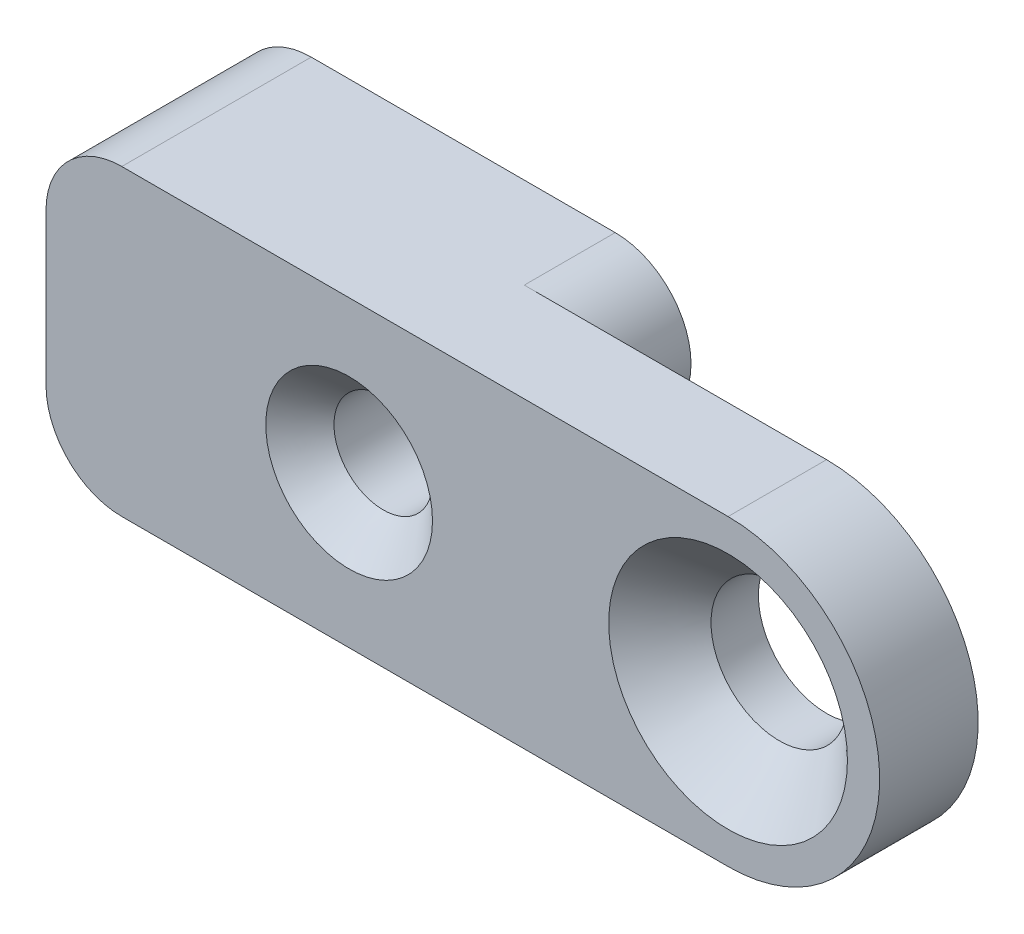
ISO-10303-21;
HEADER;
FILE_DESCRIPTION(('STEP AP214'),'2;1');
FILE_NAME('part.step','',(''),(''),'','','');
FILE_SCHEMA(('AUTOMOTIVE_DESIGN { 1 0 10303 214 1 1 1 1 }'));
ENDSEC;
DATA;
#1=APPLICATION_CONTEXT('core data for automotive mechanical design processes');
#2=APPLICATION_PROTOCOL_DEFINITION('international standard','automotive_design',2000,#1);
#3=PRODUCT_CONTEXT('',#1,'mechanical');
#4=PRODUCT('Part','Part','',(#3));
#5=PRODUCT_RELATED_PRODUCT_CATEGORY('part','',(#4));
#6=PRODUCT_DEFINITION_FORMATION('','',#4);
#7=PRODUCT_DEFINITION_CONTEXT('part definition',#1,'design');
#8=PRODUCT_DEFINITION('design','',#6,#7);
#9=PRODUCT_DEFINITION_SHAPE('','',#8);
#10=(LENGTH_UNIT() NAMED_UNIT(*) SI_UNIT(.MILLI.,.METRE.));
#11=(NAMED_UNIT(*) PLANE_ANGLE_UNIT() SI_UNIT($,.RADIAN.));
#12=(NAMED_UNIT(*) SI_UNIT($,.STERADIAN.) SOLID_ANGLE_UNIT());
#13=UNCERTAINTY_MEASURE_WITH_UNIT(LENGTH_MEASURE(1.E-05),#10,'distance_accuracy_value','');
#14=(GEOMETRIC_REPRESENTATION_CONTEXT(3) GLOBAL_UNCERTAINTY_ASSIGNED_CONTEXT((#13)) GLOBAL_UNIT_ASSIGNED_CONTEXT((#10,
#11,#12)) REPRESENTATION_CONTEXT('',''));
#15=CARTESIAN_POINT('',(0.,0.,0.));
#16=DIRECTION('',(0.,0.,1.));
#17=DIRECTION('',(1.,0.,0.));
#18=AXIS2_PLACEMENT_3D('',#15,#16,#17);
#19=CARTESIAN_POINT('',(10.,0.,2.));
#20=DIRECTION('',(0.,0.,-1.));
#21=DIRECTION('',(-1.,0.,0.));
#22=AXIS2_PLACEMENT_3D('',#19,#20,#21);
#23=CYLINDRICAL_SURFACE('',#22,4.);
#24=CARTESIAN_POINT('',(10.,0.,2.4));
#25=DIRECTION('',(0.,0.,-1.));
#26=DIRECTION('',(-1.,0.,0.));
#27=AXIS2_PLACEMENT_3D('',#24,#25,#26);
#28=CIRCLE('',#27,4.);
#29=CARTESIAN_POINT('',(10.,4.,2.4));
#30=VERTEX_POINT('',#29);
#31=CARTESIAN_POINT('',(10.,-4.,2.4));
#32=VERTEX_POINT('',#31);
#33=EDGE_CURVE('E136',#30,#32,#28,.T.);
#34=ORIENTED_EDGE('',*,*,#33,.F.);
#35=DIRECTION('',(0.,0.,-1.));
#36=VECTOR('',#35,1.);
#37=CARTESIAN_POINT('',(10.,4.,2.));
#38=LINE('',#37,#36);
#39=CARTESIAN_POINT('',(10.,4.,5.));
#40=VERTEX_POINT('',#39);
#41=EDGE_CURVE('E149',#40,#30,#38,.T.);
#42=ORIENTED_EDGE('',*,*,#41,.F.);
#43=CARTESIAN_POINT('',(10.,0.,5.));
#44=DIRECTION('',(0.,0.,1.));
#45=DIRECTION('',(1.,0.,0.));
#46=AXIS2_PLACEMENT_3D('',#43,#44,#45);
#47=CIRCLE('',#46,4.);
#48=CARTESIAN_POINT('',(10.,-4.,5.));
#49=VERTEX_POINT('',#48);
#50=EDGE_CURVE('E183',#49,#40,#47,.T.);
#51=ORIENTED_EDGE('',*,*,#50,.F.);
#52=DIRECTION('',(0.,0.,-1.));
#53=VECTOR('',#52,1.);
#54=CARTESIAN_POINT('',(10.,-4.,2.));
#55=LINE('',#54,#53);
#56=EDGE_CURVE('E152',#49,#32,#55,.T.);
#57=ORIENTED_EDGE('',*,*,#56,.T.);
#58=EDGE_LOOP('',(#34,#42,#51,#57));
#59=FACE_BOUND('',#58,.T.);
#60=ADVANCED_FACE('F32',(#59),#23,.T.);
#61=CARTESIAN_POINT('',(10.,0.,0.));
#62=DIRECTION('',(0.,0.,1.));
#63=DIRECTION('',(1.,0.,0.));
#64=AXIS2_PLACEMENT_3D('',#61,#62,#63);
#65=PLANE('',#64);
#66=DIRECTION('',(-1.,0.,0.));
#67=VECTOR('',#66,1.);
#68=CARTESIAN_POINT('',(10.,4.,0.));
#69=LINE('',#68,#67);
#70=CARTESIAN_POINT('',(2.02186581962926,4.,0.));
#71=VERTEX_POINT('',#70);
#72=CARTESIAN_POINT('',(-5.99999999999998,4.,0.));
#73=VERTEX_POINT('',#72);
#74=EDGE_CURVE('E179',#71,#73,#69,.T.);
#75=ORIENTED_EDGE('',*,*,#74,.F.);
#76=CARTESIAN_POINT('',(2.02186581962926,2.,0.));
#77=DIRECTION('',(0.,0.,1.));
#78=DIRECTION('',(1.,0.,0.));
#79=AXIS2_PLACEMENT_3D('',#76,#77,#78);
#80=CIRCLE('',#79,2.);
#81=CARTESIAN_POINT('',(3.96183765680147,1.51367781155015,0.));
#82=VERTEX_POINT('',#81);
#83=EDGE_CURVE('E216',#71,#82,#80,.F.);
#84=ORIENTED_EDGE('',*,*,#83,.T.);
#85=CARTESIAN_POINT('',(10.,0.,0.));
#86=DIRECTION('',(0.,0.,-1.));
#87=DIRECTION('',(-1.,0.,0.));
#88=AXIS2_PLACEMENT_3D('',#85,#86,#87);
#89=CIRCLE('',#88,6.225);
#90=CARTESIAN_POINT('',(3.96183765680147,-1.51367781155015,0.));
#91=VERTEX_POINT('',#90);
#92=EDGE_CURVE('E246',#91,#82,#89,.T.);
#93=ORIENTED_EDGE('',*,*,#92,.F.);
#94=CARTESIAN_POINT('',(2.02186581962926,-2.,0.));
#95=DIRECTION('',(0.,0.,1.));
#96=DIRECTION('',(1.,0.,0.));
#97=AXIS2_PLACEMENT_3D('',#94,#95,#96);
#98=CIRCLE('',#97,2.);
#99=CARTESIAN_POINT('',(2.02186581962926,-4.,0.));
#100=VERTEX_POINT('',#99);
#101=EDGE_CURVE('E213',#91,#100,#98,.F.);
#102=ORIENTED_EDGE('',*,*,#101,.T.);
#103=DIRECTION('',(1.,0.,0.));
#104=VECTOR('',#103,1.);
#105=CARTESIAN_POINT('',(10.,-4.,0.));
#106=LINE('',#105,#104);
#107=CARTESIAN_POINT('',(-5.99999999999999,-4.,0.));
#108=VERTEX_POINT('',#107);
#109=EDGE_CURVE('E190',#108,#100,#106,.T.);
#110=ORIENTED_EDGE('',*,*,#109,.F.);
#111=CARTESIAN_POINT('',(-5.99999999999999,-2.,0.));
#112=DIRECTION('',(0.,0.,1.));
#113=DIRECTION('',(1.,0.,0.));
#114=AXIS2_PLACEMENT_3D('',#111,#112,#113);
#115=CIRCLE('',#114,2.);
#116=CARTESIAN_POINT('',(-7.74060607489101,-2.9850332441357,0.));
#117=VERTEX_POINT('',#116);
#118=EDGE_CURVE('E209',#108,#117,#115,.F.);
#119=ORIENTED_EDGE('',*,*,#118,.T.);
#120=DIRECTION('',(-0.995037190209989,-0.0995037190209989,0.));
#121=VECTOR('',#120,1.);
#122=CARTESIAN_POINT('',(-7.99999999999999,-3.0109726366466,0.));
#123=LINE('',#122,#121);
#124=CARTESIAN_POINT('',(0.218908181846198,-2.18908181846198,0.));
#125=VERTEX_POINT('',#124);
#126=EDGE_CURVE('E187',#125,#117,#123,.T.);
#127=ORIENTED_EDGE('',*,*,#126,.F.);
#128=CARTESIAN_POINT('',(0.,0.,0.));
#129=DIRECTION('',(0.,0.,-1.));
#130=DIRECTION('',(-1.,0.,0.));
#131=AXIS2_PLACEMENT_3D('',#128,#129,#130);
#132=CIRCLE('',#131,2.2);
#133=CARTESIAN_POINT('',(0.218908181846198,2.18908181846198,0.));
#134=VERTEX_POINT('',#133);
#135=EDGE_CURVE('E185',#134,#125,#132,.T.);
#136=ORIENTED_EDGE('',*,*,#135,.F.);
#137=DIRECTION('',(0.995037190209989,-0.0995037190209989,0.));
#138=VECTOR('',#137,1.);
#139=CARTESIAN_POINT('',(-7.99999999999999,3.0109726366466,0.));
#140=LINE('',#139,#138);
#141=CARTESIAN_POINT('',(-7.740606074891,2.9850332441357,0.));
#142=VERTEX_POINT('',#141);
#143=EDGE_CURVE('E182',#142,#134,#140,.T.);
#144=ORIENTED_EDGE('',*,*,#143,.F.);
#145=CARTESIAN_POINT('',(-5.99999999999999,2.,0.));
#146=DIRECTION('',(0.,0.,1.));
#147=DIRECTION('',(1.,0.,0.));
#148=AXIS2_PLACEMENT_3D('',#145,#146,#147);
#149=CIRCLE('',#148,2.);
#150=EDGE_CURVE('E214',#142,#73,#149,.F.);
#151=ORIENTED_EDGE('',*,*,#150,.T.);
#152=EDGE_LOOP('',(#75,#84,#93,#102,#110,#119,#127,#136,#144,#151));
#153=FACE_BOUND('',#152,.T.);
#154=ADVANCED_FACE('F206',(#153),#65,.F.);
#155=CARTESIAN_POINT('',(10.,4.,2.));
#156=DIRECTION('',(0.,-1.,0.));
#157=DIRECTION('',(1.,0.,0.));
#158=AXIS2_PLACEMENT_3D('',#155,#156,#157);
#159=PLANE('',#158);
#160=DIRECTION('',(1.,0.,0.));
#161=VECTOR('',#160,1.);
#162=CARTESIAN_POINT('',(10.,4.,2.4));
#163=LINE('',#162,#161);
#164=CARTESIAN_POINT('',(2.02186581962926,4.,2.4));
#165=VERTEX_POINT('',#164);
#166=EDGE_CURVE('E133',#165,#30,#163,.T.);
#167=ORIENTED_EDGE('',*,*,#166,.F.);
#168=DIRECTION('',(0.,0.,-1.));
#169=VECTOR('',#168,1.);
#170=CARTESIAN_POINT('',(2.02186581962926,4.,2.));
#171=LINE('',#170,#169);
#172=EDGE_CURVE('E161',#165,#71,#171,.T.);
#173=ORIENTED_EDGE('',*,*,#172,.T.);
#174=ORIENTED_EDGE('',*,*,#74,.T.);
#175=DIRECTION('',(0.,0.,-1.));
#176=VECTOR('',#175,1.);
#177=CARTESIAN_POINT('',(-5.99999999999998,4.,2.));
#178=LINE('',#177,#176);
#179=CARTESIAN_POINT('',(-5.99999999999998,4.,5.));
#180=VERTEX_POINT('',#179);
#181=EDGE_CURVE('E158',#73,#180,#178,.F.);
#182=ORIENTED_EDGE('',*,*,#181,.T.);
#183=DIRECTION('',(-1.,0.,0.));
#184=VECTOR('',#183,1.);
#185=CARTESIAN_POINT('',(10.,4.,5.));
#186=LINE('',#185,#184);
#187=EDGE_CURVE('E157',#40,#180,#186,.T.);
#188=ORIENTED_EDGE('',*,*,#187,.F.);
#189=ORIENTED_EDGE('',*,*,#41,.T.);
#190=EDGE_LOOP('',(#167,#173,#174,#182,#188,#189));
#191=FACE_BOUND('',#190,.T.);
#192=ADVANCED_FACE('F156',(#191),#159,.F.);
#193=CARTESIAN_POINT('',(-7.99999999999999,3.0109726366466,2.));
#194=DIRECTION('',(0.0995037190209989,0.995037190209989,0.));
#195=DIRECTION('',(-0.995037190209989,0.099503719020999,0.));
#196=AXIS2_PLACEMENT_3D('',#193,#194,#195);
#197=PLANE('',#196);
#198=DIRECTION('',(0.995037190209989,-0.0995037190209989,0.));
#199=VECTOR('',#198,1.);
#200=CARTESIAN_POINT('',(-7.99999999999999,3.0109726366466,2.));
#201=LINE('',#200,#199);
#202=CARTESIAN_POINT('',(-7.740606074891,2.9850332441357,2.));
#203=VERTEX_POINT('',#202);
#204=CARTESIAN_POINT('',(0.218908181846198,2.18908181846198,2.));
#205=VERTEX_POINT('',#204);
#206=EDGE_CURVE('E193',#203,#205,#201,.T.);
#207=ORIENTED_EDGE('',*,*,#206,.F.);
#208=DIRECTION('',(0.,0.,-1.));
#209=VECTOR('',#208,1.);
#210=CARTESIAN_POINT('',(-7.740606074891,2.9850332441357,2.));
#211=LINE('',#210,#209);
#212=EDGE_CURVE('E281',#203,#142,#211,.T.);
#213=ORIENTED_EDGE('',*,*,#212,.T.);
#214=ORIENTED_EDGE('',*,*,#143,.T.);
#215=DIRECTION('',(0.,0.,-1.));
#216=VECTOR('',#215,1.);
#217=CARTESIAN_POINT('',(0.218908181846198,2.18908181846198,2.));
#218=LINE('',#217,#216);
#219=EDGE_CURVE('E159',#205,#134,#218,.T.);
#220=ORIENTED_EDGE('',*,*,#219,.F.);
#221=EDGE_LOOP('',(#207,#213,#214,#220));
#222=FACE_BOUND('',#221,.T.);
#223=ADVANCED_FACE('F297',(#222),#197,.F.);
#224=CARTESIAN_POINT('',(0.,0.,2.));
#225=DIRECTION('',(0.,0.,-1.));
#226=DIRECTION('',(-1.,0.,0.));
#227=AXIS2_PLACEMENT_3D('',#224,#225,#226);
#228=CYLINDRICAL_SURFACE('',#227,2.2);
#229=ORIENTED_EDGE('',*,*,#135,.T.);
#230=DIRECTION('',(0.,0.,-1.));
#231=VECTOR('',#230,1.);
#232=CARTESIAN_POINT('',(0.218908181846198,-2.18908181846198,2.));
#233=LINE('',#232,#231);
#234=CARTESIAN_POINT('',(0.218908181846198,-2.18908181846198,2.));
#235=VERTEX_POINT('',#234);
#236=EDGE_CURVE('E164',#235,#125,#233,.T.);
#237=ORIENTED_EDGE('',*,*,#236,.F.);
#238=CARTESIAN_POINT('',(0.,0.,2.));
#239=DIRECTION('',(0.,0.,-1.));
#240=DIRECTION('',(-1.,0.,0.));
#241=AXIS2_PLACEMENT_3D('',#238,#239,#240);
#242=CIRCLE('',#241,2.2);
#243=EDGE_CURVE('E172',#205,#235,#242,.T.);
#244=ORIENTED_EDGE('',*,*,#243,.F.);
#245=ORIENTED_EDGE('',*,*,#219,.T.);
#246=EDGE_LOOP('',(#229,#237,#244,#245));
#247=FACE_BOUND('',#246,.T.);
#248=ADVANCED_FACE('F417',(#247),#228,.F.);
#249=CARTESIAN_POINT('',(-7.99999999999999,-3.0109726366466,2.));
#250=DIRECTION('',(0.0995037190209989,-0.995037190209989,0.));
#251=DIRECTION('',(0.995037190209989,0.099503719020999,0.));
#252=AXIS2_PLACEMENT_3D('',#249,#250,#251);
#253=PLANE('',#252);
#254=ORIENTED_EDGE('',*,*,#126,.T.);
#255=DIRECTION('',(0.,0.,-1.));
#256=VECTOR('',#255,1.);
#257=CARTESIAN_POINT('',(-7.74060607489101,-2.9850332441357,0.));
#258=LINE('',#257,#256);
#259=CARTESIAN_POINT('',(-7.74060607489101,-2.9850332441357,2.));
#260=VERTEX_POINT('',#259);
#261=EDGE_CURVE('E231',#117,#260,#258,.F.);
#262=ORIENTED_EDGE('',*,*,#261,.T.);
#263=DIRECTION('',(-0.995037190209989,-0.0995037190209989,0.));
#264=VECTOR('',#263,1.);
#265=CARTESIAN_POINT('',(-7.99999999999999,-3.0109726366466,2.));
#266=LINE('',#265,#264);
#267=EDGE_CURVE('E168',#235,#260,#266,.T.);
#268=ORIENTED_EDGE('',*,*,#267,.F.);
#269=ORIENTED_EDGE('',*,*,#236,.T.);
#270=EDGE_LOOP('',(#254,#262,#268,#269));
#271=FACE_BOUND('',#270,.T.);
#272=ADVANCED_FACE('F198',(#271),#253,.F.);
#273=CARTESIAN_POINT('',(-8.,-4.,2.));
#274=DIRECTION('',(1.,0.,0.));
#275=DIRECTION('',(0.,1.,0.));
#276=AXIS2_PLACEMENT_3D('',#273,#274,#275);
#277=PLANE('',#276);
#278=DIRECTION('',(0.,-1.,0.));
#279=VECTOR('',#278,1.);
#280=CARTESIAN_POINT('',(-8.,4.,2.));
#281=LINE('',#280,#279);
#282=CARTESIAN_POINT('',(-8.,2.,2.));
#283=VERTEX_POINT('',#282);
#284=CARTESIAN_POINT('',(-8.,-1.99999999999999,2.));
#285=VERTEX_POINT('',#284);
#286=EDGE_CURVE('E144',#283,#285,#281,.T.);
#287=ORIENTED_EDGE('',*,*,#286,.T.);
#288=DIRECTION('',(0.,0.,-1.));
#289=VECTOR('',#288,1.);
#290=CARTESIAN_POINT('',(-7.99999999999999,-1.99999999999999,2.));
#291=LINE('',#290,#289);
#292=CARTESIAN_POINT('',(-8.,-1.99999999999999,5.));
#293=VERTEX_POINT('',#292);
#294=EDGE_CURVE('E47',#285,#293,#291,.F.);
#295=ORIENTED_EDGE('',*,*,#294,.T.);
#296=DIRECTION('',(0.,-1.,0.));
#297=VECTOR('',#296,1.);
#298=CARTESIAN_POINT('',(-8.,4.,5.));
#299=LINE('',#298,#297);
#300=CARTESIAN_POINT('',(-8.,2.,5.));
#301=VERTEX_POINT('',#300);
#302=EDGE_CURVE('E241',#301,#293,#299,.T.);
#303=ORIENTED_EDGE('',*,*,#302,.F.);
#304=DIRECTION('',(0.,0.,-1.));
#305=VECTOR('',#304,1.);
#306=CARTESIAN_POINT('',(-7.99999999999999,2.,2.));
#307=LINE('',#306,#305);
#308=EDGE_CURVE('E287',#301,#283,#307,.T.);
#309=ORIENTED_EDGE('',*,*,#308,.T.);
#310=EDGE_LOOP('',(#287,#295,#303,#309));
#311=FACE_BOUND('',#310,.T.);
#312=ADVANCED_FACE('F396',(#311),#277,.F.);
#313=CARTESIAN_POINT('',(10.,-4.,2.));
#314=DIRECTION('',(0.,1.,0.));
#315=DIRECTION('',(-1.,0.,0.));
#316=AXIS2_PLACEMENT_3D('',#313,#314,#315);
#317=PLANE('',#316);
#318=ORIENTED_EDGE('',*,*,#109,.T.);
#319=DIRECTION('',(0.,0.,-1.));
#320=VECTOR('',#319,1.);
#321=CARTESIAN_POINT('',(2.02186581962926,-4.,2.));
#322=LINE('',#321,#320);
#323=CARTESIAN_POINT('',(2.02186581962926,-4.,2.4));
#324=VERTEX_POINT('',#323);
#325=EDGE_CURVE('E228',#100,#324,#322,.F.);
#326=ORIENTED_EDGE('',*,*,#325,.T.);
#327=DIRECTION('',(-1.,0.,0.));
#328=VECTOR('',#327,1.);
#329=CARTESIAN_POINT('',(10.,-4.,2.4));
#330=LINE('',#329,#328);
#331=EDGE_CURVE('E153',#32,#324,#330,.T.);
#332=ORIENTED_EDGE('',*,*,#331,.F.);
#333=ORIENTED_EDGE('',*,*,#56,.F.);
#334=DIRECTION('',(1.,0.,0.));
#335=VECTOR('',#334,1.);
#336=CARTESIAN_POINT('',(-8.,-4.,5.));
#337=LINE('',#336,#335);
#338=CARTESIAN_POINT('',(-5.99999999999999,-4.,5.));
#339=VERTEX_POINT('',#338);
#340=EDGE_CURVE('E239',#339,#49,#337,.T.);
#341=ORIENTED_EDGE('',*,*,#340,.F.);
#342=DIRECTION('',(0.,0.,-1.));
#343=VECTOR('',#342,1.);
#344=CARTESIAN_POINT('',(-5.99999999999999,-4.,2.));
#345=LINE('',#344,#343);
#346=EDGE_CURVE('E226',#339,#108,#345,.T.);
#347=ORIENTED_EDGE('',*,*,#346,.T.);
#348=EDGE_LOOP('',(#318,#326,#332,#333,#341,#347));
#349=FACE_BOUND('',#348,.T.);
#350=ADVANCED_FACE('F386',(#349),#317,.F.);
#351=CARTESIAN_POINT('',(10.,0.,2.));
#352=DIRECTION('',(0.,0.,1.));
#353=DIRECTION('',(1.,0.,0.));
#354=AXIS2_PLACEMENT_3D('',#351,#352,#353);
#355=PLANE('',#354);
#356=CARTESIAN_POINT('',(0.,0.,2.));
#357=DIRECTION('',(0.,0.,1.));
#358=DIRECTION('',(1.,0.,0.));
#359=AXIS2_PLACEMENT_3D('',#356,#357,#358);
#360=CIRCLE('',#359,1.3);
#361=CARTESIAN_POINT('',(1.3,0.,2.));
#362=VERTEX_POINT('',#361);
#363=EDGE_CURVE('E257',#362,#362,#360,.T.);
#364=ORIENTED_EDGE('',*,*,#363,.T.);
#365=EDGE_LOOP('',(#364));
#366=FACE_BOUND('',#365,.T.);
#367=ORIENTED_EDGE('',*,*,#267,.T.);
#368=CARTESIAN_POINT('',(-5.99999999999999,-2.,2.));
#369=DIRECTION('',(0.,0.,1.));
#370=DIRECTION('',(1.,0.,0.));
#371=AXIS2_PLACEMENT_3D('',#368,#369,#370);
#372=CIRCLE('',#371,2.);
#373=EDGE_CURVE('E289',#260,#285,#372,.F.);
#374=ORIENTED_EDGE('',*,*,#373,.T.);
#375=ORIENTED_EDGE('',*,*,#286,.F.);
#376=CARTESIAN_POINT('',(-5.99999999999999,2.,2.));
#377=DIRECTION('',(0.,0.,1.));
#378=DIRECTION('',(1.,0.,0.));
#379=AXIS2_PLACEMENT_3D('',#376,#377,#378);
#380=CIRCLE('',#379,2.);
#381=EDGE_CURVE('E233',#283,#203,#380,.F.);
#382=ORIENTED_EDGE('',*,*,#381,.T.);
#383=ORIENTED_EDGE('',*,*,#206,.T.);
#384=ORIENTED_EDGE('',*,*,#243,.T.);
#385=EDGE_LOOP('',(#367,#374,#375,#382,#383,#384));
#386=FACE_BOUND('',#385,.T.);
#387=ADVANCED_FACE('F271',(#366,#386),#355,.F.);
#388=CARTESIAN_POINT('',(10.,0.,5.));
#389=DIRECTION('',(0.,0.,1.));
#390=DIRECTION('',(1.,0.,0.));
#391=AXIS2_PLACEMENT_3D('',#388,#389,#390);
#392=PLANE('',#391);
#393=CARTESIAN_POINT('',(0.,0.,5.));
#394=DIRECTION('',(0.,0.,1.));
#395=DIRECTION('',(1.,0.,0.));
#396=AXIS2_PLACEMENT_3D('',#393,#394,#395);
#397=CIRCLE('',#396,2.2);
#398=CARTESIAN_POINT('',(2.2,0.,5.));
#399=VERTEX_POINT('',#398);
#400=EDGE_CURVE('E261',#399,#399,#397,.T.);
#401=ORIENTED_EDGE('',*,*,#400,.F.);
#402=EDGE_LOOP('',(#401));
#403=FACE_BOUND('',#402,.T.);
#404=CARTESIAN_POINT('',(10.,0.,5.));
#405=DIRECTION('',(0.,0.,1.));
#406=DIRECTION('',(1.,0.,0.));
#407=AXIS2_PLACEMENT_3D('',#404,#405,#406);
#408=CIRCLE('',#407,3.15);
#409=CARTESIAN_POINT('',(13.15,0.,5.));
#410=VERTEX_POINT('',#409);
#411=EDGE_CURVE('E254',#410,#410,#408,.T.);
#412=ORIENTED_EDGE('',*,*,#411,.F.);
#413=EDGE_LOOP('',(#412));
#414=FACE_BOUND('',#413,.T.);
#415=ORIENTED_EDGE('',*,*,#302,.T.);
#416=CARTESIAN_POINT('',(-5.99999999999999,-2.,5.));
#417=DIRECTION('',(0.,0.,1.));
#418=DIRECTION('',(1.,0.,0.));
#419=AXIS2_PLACEMENT_3D('',#416,#417,#418);
#420=CIRCLE('',#419,2.);
#421=EDGE_CURVE('E275',#293,#339,#420,.T.);
#422=ORIENTED_EDGE('',*,*,#421,.T.);
#423=ORIENTED_EDGE('',*,*,#340,.T.);
#424=ORIENTED_EDGE('',*,*,#50,.T.);
#425=ORIENTED_EDGE('',*,*,#187,.T.);
#426=CARTESIAN_POINT('',(-5.99999999999999,2.,5.));
#427=DIRECTION('',(0.,0.,1.));
#428=DIRECTION('',(1.,0.,0.));
#429=AXIS2_PLACEMENT_3D('',#426,#427,#428);
#430=CIRCLE('',#429,2.);
#431=EDGE_CURVE('E54',#180,#301,#430,.T.);
#432=ORIENTED_EDGE('',*,*,#431,.T.);
#433=EDGE_LOOP('',(#415,#422,#423,#424,#425,#432));
#434=FACE_BOUND('',#433,.T.);
#435=ADVANCED_FACE('F267',(#403,#414,#434),#392,.T.);
#436=CARTESIAN_POINT('',(10.,0.,2.4));
#437=DIRECTION('',(0.,0.,-1.));
#438=DIRECTION('',(-1.,0.,0.));
#439=AXIS2_PLACEMENT_3D('',#436,#437,#438);
#440=CYLINDRICAL_SURFACE('',#439,6.225);
#441=ORIENTED_EDGE('',*,*,#92,.T.);
#442=DIRECTION('',(0.,0.,-1.));
#443=VECTOR('',#442,1.);
#444=CARTESIAN_POINT('',(3.96183765680147,1.51367781155015,2.4));
#445=LINE('',#444,#443);
#446=CARTESIAN_POINT('',(3.96183765680147,1.51367781155015,2.4));
#447=VERTEX_POINT('',#446);
#448=EDGE_CURVE('E224',#82,#447,#445,.F.);
#449=ORIENTED_EDGE('',*,*,#448,.T.);
#450=CARTESIAN_POINT('',(10.,0.,2.4));
#451=DIRECTION('',(0.,0.,-1.));
#452=DIRECTION('',(-1.,0.,0.));
#453=AXIS2_PLACEMENT_3D('',#450,#451,#452);
#454=CIRCLE('',#453,6.225);
#455=CARTESIAN_POINT('',(3.96183765680147,-1.51367781155015,2.4));
#456=VERTEX_POINT('',#455);
#457=EDGE_CURVE('E245',#456,#447,#454,.T.);
#458=ORIENTED_EDGE('',*,*,#457,.F.);
#459=DIRECTION('',(0.,0.,-1.));
#460=VECTOR('',#459,1.);
#461=CARTESIAN_POINT('',(3.96183765680147,-1.51367781155015,2.4));
#462=LINE('',#461,#460);
#463=EDGE_CURVE('E222',#456,#91,#462,.T.);
#464=ORIENTED_EDGE('',*,*,#463,.T.);
#465=EDGE_LOOP('',(#441,#449,#458,#464));
#466=FACE_BOUND('',#465,.T.);
#467=ADVANCED_FACE('F270',(#466),#440,.F.);
#468=CARTESIAN_POINT('',(10.,0.,2.4));
#469=DIRECTION('',(0.,0.,-1.));
#470=DIRECTION('',(-1.,0.,0.));
#471=AXIS2_PLACEMENT_3D('',#468,#469,#470);
#472=PLANE('',#471);
#473=CARTESIAN_POINT('',(10.,0.,2.4));
#474=DIRECTION('',(0.,0.,-1.));
#475=DIRECTION('',(-1.,0.,0.));
#476=AXIS2_PLACEMENT_3D('',#473,#474,#475);
#477=CIRCLE('',#476,1.79999999999999);
#478=CARTESIAN_POINT('',(8.20000000000001,0.,2.4));
#479=VERTEX_POINT('',#478);
#480=EDGE_CURVE('E249',#479,#479,#477,.T.);
#481=ORIENTED_EDGE('',*,*,#480,.F.);
#482=EDGE_LOOP('',(#481));
#483=FACE_BOUND('',#482,.T.);
#484=ORIENTED_EDGE('',*,*,#166,.T.);
#485=ORIENTED_EDGE('',*,*,#33,.T.);
#486=ORIENTED_EDGE('',*,*,#331,.T.);
#487=CARTESIAN_POINT('',(2.02186581962926,-2.,2.4));
#488=DIRECTION('',(0.,0.,-1.));
#489=DIRECTION('',(-1.,0.,0.));
#490=AXIS2_PLACEMENT_3D('',#487,#488,#489);
#491=CIRCLE('',#490,2.);
#492=EDGE_CURVE('E11',#324,#456,#491,.F.);
#493=ORIENTED_EDGE('',*,*,#492,.T.);
#494=ORIENTED_EDGE('',*,*,#457,.T.);
#495=CARTESIAN_POINT('',(2.02186581962926,2.,2.4));
#496=DIRECTION('',(0.,0.,-1.));
#497=DIRECTION('',(-1.,0.,0.));
#498=AXIS2_PLACEMENT_3D('',#495,#496,#497);
#499=CIRCLE('',#498,2.);
#500=EDGE_CURVE('E40',#447,#165,#499,.F.);
#501=ORIENTED_EDGE('',*,*,#500,.T.);
#502=EDGE_LOOP('',(#484,#485,#486,#493,#494,#501));
#503=FACE_BOUND('',#502,.T.);
#504=ADVANCED_FACE('F135',(#483,#503),#472,.T.);
#505=CARTESIAN_POINT('',(10.,0.,5.));
#506=DIRECTION('',(0.,0.,1.));
#507=DIRECTION('',(1.,0.,0.));
#508=AXIS2_PLACEMENT_3D('',#505,#506,#507);
#509=CYLINDRICAL_SURFACE('',#508,1.79999999999999);
#510=ORIENTED_EDGE('',*,*,#480,.T.);
#511=EDGE_LOOP('',(#510));
#512=FACE_BOUND('',#511,.T.);
#513=CARTESIAN_POINT('',(10.,0.,3.65));
#514=DIRECTION('',(0.,0.,1.));
#515=DIRECTION('',(1.,0.,0.));
#516=AXIS2_PLACEMENT_3D('',#513,#514,#515);
#517=CIRCLE('',#516,1.79999999999999);
#518=CARTESIAN_POINT('',(11.8,0.,3.65));
#519=VERTEX_POINT('',#518);
#520=EDGE_CURVE('E251',#519,#519,#517,.T.);
#521=ORIENTED_EDGE('',*,*,#520,.T.);
#522=EDGE_LOOP('',(#521));
#523=FACE_BOUND('',#522,.T.);
#524=ADVANCED_FACE('F306',(#512,#523),#509,.F.);
#525=CARTESIAN_POINT('',(10.,0.,5.));
#526=DIRECTION('',(0.,0.,1.));
#527=DIRECTION('',(1.,0.,0.));
#528=AXIS2_PLACEMENT_3D('',#525,#526,#527);
#529=CONICAL_SURFACE('',#528,3.15,0.785398163397451);
#530=ORIENTED_EDGE('',*,*,#520,.F.);
#531=EDGE_LOOP('',(#530));
#532=FACE_BOUND('',#531,.T.);
#533=ORIENTED_EDGE('',*,*,#411,.T.);
#534=EDGE_LOOP('',(#533));
#535=FACE_BOUND('',#534,.T.);
#536=ADVANCED_FACE('F315',(#532,#535),#529,.F.);
#537=CARTESIAN_POINT('',(0.,0.,5.));
#538=DIRECTION('',(0.,0.,1.));
#539=DIRECTION('',(1.,0.,0.));
#540=AXIS2_PLACEMENT_3D('',#537,#538,#539);
#541=CYLINDRICAL_SURFACE('',#540,1.3);
#542=CARTESIAN_POINT('',(0.,0.,4.1));
#543=DIRECTION('',(0.,0.,1.));
#544=DIRECTION('',(1.,0.,0.));
#545=AXIS2_PLACEMENT_3D('',#542,#543,#544);
#546=CIRCLE('',#545,1.3);
#547=CARTESIAN_POINT('',(1.3,0.,4.1));
#548=VERTEX_POINT('',#547);
#549=EDGE_CURVE('E258',#548,#548,#546,.T.);
#550=ORIENTED_EDGE('',*,*,#549,.T.);
#551=EDGE_LOOP('',(#550));
#552=FACE_BOUND('',#551,.T.);
#553=ORIENTED_EDGE('',*,*,#363,.F.);
#554=EDGE_LOOP('',(#553));
#555=FACE_BOUND('',#554,.T.);
#556=ADVANCED_FACE('F447',(#552,#555),#541,.F.);
#557=CARTESIAN_POINT('',(0.,0.,5.));
#558=DIRECTION('',(0.,0.,1.));
#559=DIRECTION('',(1.,0.,0.));
#560=AXIS2_PLACEMENT_3D('',#557,#558,#559);
#561=CONICAL_SURFACE('',#560,2.2,0.785398163397449);
#562=ORIENTED_EDGE('',*,*,#549,.F.);
#563=EDGE_LOOP('',(#562));
#564=FACE_BOUND('',#563,.T.);
#565=ORIENTED_EDGE('',*,*,#400,.T.);
#566=EDGE_LOOP('',(#565));
#567=FACE_BOUND('',#566,.T.);
#568=ADVANCED_FACE('F265',(#564,#567),#561,.F.);
#569=CARTESIAN_POINT('',(2.02186581962926,2.,2.4));
#570=DIRECTION('',(0.,0.,-1.));
#571=DIRECTION('',(-1.,0.,0.));
#572=AXIS2_PLACEMENT_3D('',#569,#570,#571);
#573=CYLINDRICAL_SURFACE('',#572,2.);
#574=ORIENTED_EDGE('',*,*,#500,.F.);
#575=ORIENTED_EDGE('',*,*,#448,.F.);
#576=ORIENTED_EDGE('',*,*,#83,.F.);
#577=ORIENTED_EDGE('',*,*,#172,.F.);
#578=EDGE_LOOP('',(#574,#575,#576,#577));
#579=FACE_BOUND('',#578,.T.);
#580=ADVANCED_FACE('F328',(#579),#573,.T.);
#581=CARTESIAN_POINT('',(2.02186581962926,-2.,2.4));
#582=DIRECTION('',(0.,0.,-1.));
#583=DIRECTION('',(-1.,0.,0.));
#584=AXIS2_PLACEMENT_3D('',#581,#582,#583);
#585=CYLINDRICAL_SURFACE('',#584,2.);
#586=ORIENTED_EDGE('',*,*,#101,.F.);
#587=ORIENTED_EDGE('',*,*,#463,.F.);
#588=ORIENTED_EDGE('',*,*,#492,.F.);
#589=ORIENTED_EDGE('',*,*,#325,.F.);
#590=EDGE_LOOP('',(#586,#587,#588,#589));
#591=FACE_BOUND('',#590,.T.);
#592=ADVANCED_FACE('F331',(#591),#585,.T.);
#593=CARTESIAN_POINT('',(-5.99999999999999,-2.,2.));
#594=DIRECTION('',(0.,0.,-1.));
#595=DIRECTION('',(-1.,0.,0.));
#596=AXIS2_PLACEMENT_3D('',#593,#594,#595);
#597=CYLINDRICAL_SURFACE('',#596,2.);
#598=ORIENTED_EDGE('',*,*,#421,.F.);
#599=ORIENTED_EDGE('',*,*,#294,.F.);
#600=ORIENTED_EDGE('',*,*,#373,.F.);
#601=ORIENTED_EDGE('',*,*,#261,.F.);
#602=ORIENTED_EDGE('',*,*,#118,.F.);
#603=ORIENTED_EDGE('',*,*,#346,.F.);
#604=EDGE_LOOP('',(#598,#599,#600,#601,#602,#603));
#605=FACE_BOUND('',#604,.T.);
#606=ADVANCED_FACE('F279',(#605),#597,.T.);
#607=CARTESIAN_POINT('',(-5.99999999999999,2.,2.));
#608=DIRECTION('',(0.,0.,-1.));
#609=DIRECTION('',(-1.,0.,0.));
#610=AXIS2_PLACEMENT_3D('',#607,#608,#609);
#611=CYLINDRICAL_SURFACE('',#610,2.);
#612=ORIENTED_EDGE('',*,*,#431,.F.);
#613=ORIENTED_EDGE('',*,*,#181,.F.);
#614=ORIENTED_EDGE('',*,*,#150,.F.);
#615=ORIENTED_EDGE('',*,*,#212,.F.);
#616=ORIENTED_EDGE('',*,*,#381,.F.);
#617=ORIENTED_EDGE('',*,*,#308,.F.);
#618=EDGE_LOOP('',(#612,#613,#614,#615,#616,#617));
#619=FACE_BOUND('',#618,.T.);
#620=ADVANCED_FACE('F34',(#619),#611,.T.);
#621=CLOSED_SHELL('',(#60,#154,#192,#223,#248,#272,#312,#350,#387,#435,#467,#504,#524,#536,#556,
#568,#580,#592,#606,#620));
#622=MANIFOLD_SOLID_BREP('B2',#621);
#623=ADVANCED_BREP_SHAPE_REPRESENTATION('',(#18,#622),#14);
#624=SHAPE_DEFINITION_REPRESENTATION(#9,#623);
ENDSEC;
END-ISO-10303-21;
